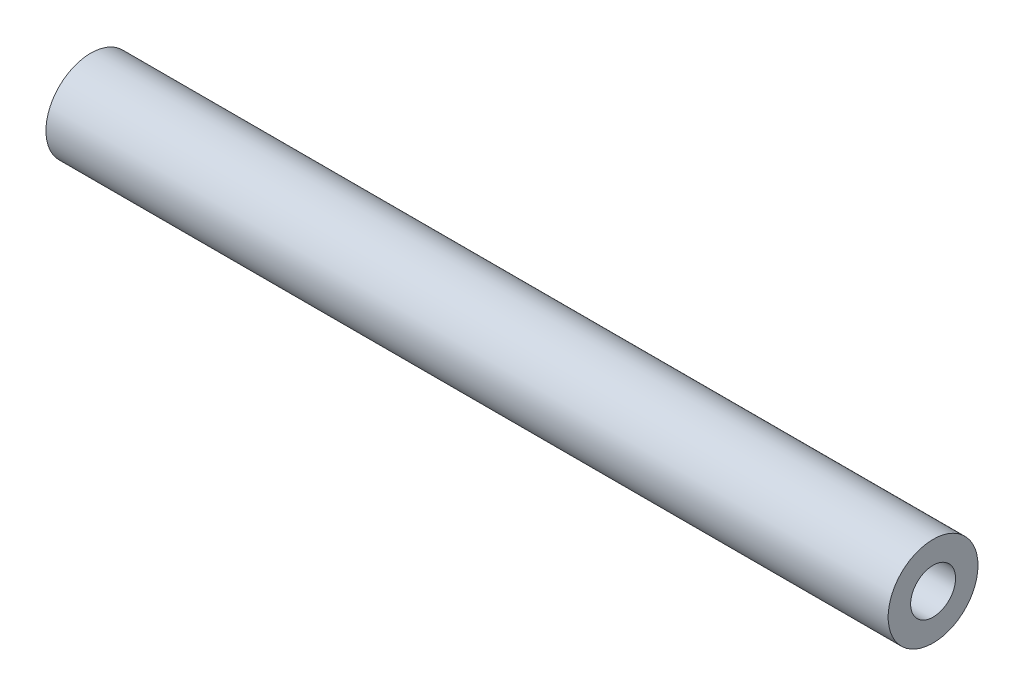
ISO-10303-21;
HEADER;
FILE_DESCRIPTION(('STEP AP214'),'2;1');
FILE_NAME('part.step','',(''),(''),'','','');
FILE_SCHEMA(('AUTOMOTIVE_DESIGN { 1 0 10303 214 1 1 1 1 }'));
ENDSEC;
DATA;
#1=APPLICATION_CONTEXT('core data for automotive mechanical design processes');
#2=APPLICATION_PROTOCOL_DEFINITION('international standard','automotive_design',2000,#1);
#3=PRODUCT_CONTEXT('',#1,'mechanical');
#4=PRODUCT('Part','Part','',(#3));
#5=PRODUCT_RELATED_PRODUCT_CATEGORY('part','',(#4));
#6=PRODUCT_DEFINITION_FORMATION('','',#4);
#7=PRODUCT_DEFINITION_CONTEXT('part definition',#1,'design');
#8=PRODUCT_DEFINITION('design','',#6,#7);
#9=PRODUCT_DEFINITION_SHAPE('','',#8);
#10=(LENGTH_UNIT() NAMED_UNIT(*) SI_UNIT(.MILLI.,.METRE.));
#11=(NAMED_UNIT(*) PLANE_ANGLE_UNIT() SI_UNIT($,.RADIAN.));
#12=(NAMED_UNIT(*) SI_UNIT($,.STERADIAN.) SOLID_ANGLE_UNIT());
#13=UNCERTAINTY_MEASURE_WITH_UNIT(LENGTH_MEASURE(1.E-05),#10,'distance_accuracy_value','');
#14=(GEOMETRIC_REPRESENTATION_CONTEXT(3) GLOBAL_UNCERTAINTY_ASSIGNED_CONTEXT((#13)) GLOBAL_UNIT_ASSIGNED_CONTEXT((#10,
#11,#12)) REPRESENTATION_CONTEXT('',''));
#15=CARTESIAN_POINT('',(0.,0.,0.));
#16=DIRECTION('',(0.,0.,1.));
#17=DIRECTION('',(1.,0.,0.));
#18=AXIS2_PLACEMENT_3D('',#15,#16,#17);
#19=CARTESIAN_POINT('',(37.5,0.,0.));
#20=DIRECTION('',(-1.,0.,0.));
#21=DIRECTION('',(0.,0.,1.));
#22=AXIS2_PLACEMENT_3D('',#19,#20,#21);
#23=CYLINDRICAL_SURFACE('',#22,4.);
#24=CARTESIAN_POINT('',(37.5,0.,0.));
#25=DIRECTION('',(1.,0.,0.));
#26=DIRECTION('',(0.,0.,-1.));
#27=AXIS2_PLACEMENT_3D('',#24,#25,#26);
#28=CIRCLE('',#27,4.);
#29=CARTESIAN_POINT('',(37.5,0.,-4.));
#30=VERTEX_POINT('',#29);
#31=EDGE_CURVE('E10',#30,#30,#28,.T.);
#32=ORIENTED_EDGE('',*,*,#31,.F.);
#33=EDGE_LOOP('',(#32));
#34=FACE_BOUND('',#33,.T.);
#35=CARTESIAN_POINT('',(-37.5,0.,0.));
#36=DIRECTION('',(1.,0.,0.));
#37=DIRECTION('',(0.,0.,-1.));
#38=AXIS2_PLACEMENT_3D('',#35,#36,#37);
#39=CIRCLE('',#38,4.);
#40=CARTESIAN_POINT('',(-37.5,0.,-4.));
#41=VERTEX_POINT('',#40);
#42=EDGE_CURVE('E46',#41,#41,#39,.T.);
#43=ORIENTED_EDGE('',*,*,#42,.T.);
#44=EDGE_LOOP('',(#43));
#45=FACE_BOUND('',#44,.T.);
#46=ADVANCED_FACE('F43',(#34,#45),#23,.T.);
#47=CARTESIAN_POINT('',(37.5,0.,0.));
#48=DIRECTION('',(1.,0.,0.));
#49=DIRECTION('',(0.,0.,-1.));
#50=AXIS2_PLACEMENT_3D('',#47,#48,#49);
#51=PLANE('',#50);
#52=CARTESIAN_POINT('',(37.5,0.,0.));
#53=DIRECTION('',(1.,0.,0.));
#54=DIRECTION('',(0.,0.,-1.));
#55=AXIS2_PLACEMENT_3D('',#52,#53,#54);
#56=CIRCLE('',#55,2.);
#57=CARTESIAN_POINT('',(37.5,0.,-2.));
#58=VERTEX_POINT('',#57);
#59=EDGE_CURVE('E59',#58,#58,#56,.T.);
#60=ORIENTED_EDGE('',*,*,#59,.F.);
#61=EDGE_LOOP('',(#60));
#62=FACE_BOUND('',#61,.T.);
#63=ORIENTED_EDGE('',*,*,#31,.T.);
#64=EDGE_LOOP('',(#63));
#65=FACE_BOUND('',#64,.T.);
#66=ADVANCED_FACE('F90',(#62,#65),#51,.T.);
#67=CARTESIAN_POINT('',(-37.5,0.,0.));
#68=DIRECTION('',(1.,0.,0.));
#69=DIRECTION('',(0.,0.,-1.));
#70=AXIS2_PLACEMENT_3D('',#67,#68,#69);
#71=PLANE('',#70);
#72=CARTESIAN_POINT('',(-37.5,0.,0.));
#73=DIRECTION('',(-1.,0.,0.));
#74=DIRECTION('',(0.,0.,1.));
#75=AXIS2_PLACEMENT_3D('',#72,#73,#74);
#76=CIRCLE('',#75,2.);
#77=CARTESIAN_POINT('',(-37.5,0.,2.));
#78=VERTEX_POINT('',#77);
#79=EDGE_CURVE('E69',#78,#78,#76,.T.);
#80=ORIENTED_EDGE('',*,*,#79,.F.);
#81=EDGE_LOOP('',(#80));
#82=FACE_BOUND('',#81,.T.);
#83=ORIENTED_EDGE('',*,*,#42,.F.);
#84=EDGE_LOOP('',(#83));
#85=FACE_BOUND('',#84,.T.);
#86=ADVANCED_FACE('F83',(#82,#85),#71,.F.);
#87=CARTESIAN_POINT('',(22.5,0.,0.));
#88=DIRECTION('',(1.,0.,0.));
#89=DIRECTION('',(0.,0.,-1.));
#90=AXIS2_PLACEMENT_3D('',#87,#88,#89);
#91=CYLINDRICAL_SURFACE('',#90,2.);
#92=CARTESIAN_POINT('',(22.5,0.,0.));
#93=DIRECTION('',(1.,0.,0.));
#94=DIRECTION('',(0.,0.,-1.));
#95=AXIS2_PLACEMENT_3D('',#92,#93,#94);
#96=CIRCLE('',#95,2.);
#97=CARTESIAN_POINT('',(22.5,0.,-2.));
#98=VERTEX_POINT('',#97);
#99=EDGE_CURVE('E57',#98,#98,#96,.T.);
#100=ORIENTED_EDGE('',*,*,#99,.F.);
#101=EDGE_LOOP('',(#100));
#102=FACE_BOUND('',#101,.T.);
#103=ORIENTED_EDGE('',*,*,#59,.T.);
#104=EDGE_LOOP('',(#103));
#105=FACE_BOUND('',#104,.T.);
#106=ADVANCED_FACE('F86',(#102,#105),#91,.F.);
#107=CARTESIAN_POINT('',(22.5,0.,0.));
#108=DIRECTION('',(1.,0.,0.));
#109=DIRECTION('',(0.,0.,-1.));
#110=AXIS2_PLACEMENT_3D('',#107,#108,#109);
#111=PLANE('',#110);
#112=ORIENTED_EDGE('',*,*,#99,.T.);
#113=EDGE_LOOP('',(#112));
#114=FACE_BOUND('',#113,.T.);
#115=ADVANCED_FACE('F78',(#114),#111,.T.);
#116=CARTESIAN_POINT('',(-22.5,0.,0.));
#117=DIRECTION('',(-1.,0.,0.));
#118=DIRECTION('',(0.,0.,1.));
#119=AXIS2_PLACEMENT_3D('',#116,#117,#118);
#120=CYLINDRICAL_SURFACE('',#119,2.);
#121=CARTESIAN_POINT('',(-22.5,0.,0.));
#122=DIRECTION('',(-1.,0.,0.));
#123=DIRECTION('',(0.,0.,1.));
#124=AXIS2_PLACEMENT_3D('',#121,#122,#123);
#125=CIRCLE('',#124,2.);
#126=CARTESIAN_POINT('',(-22.5,0.,2.));
#127=VERTEX_POINT('',#126);
#128=EDGE_CURVE('E61',#127,#127,#125,.T.);
#129=ORIENTED_EDGE('',*,*,#128,.F.);
#130=EDGE_LOOP('',(#129));
#131=FACE_BOUND('',#130,.T.);
#132=ORIENTED_EDGE('',*,*,#79,.T.);
#133=EDGE_LOOP('',(#132));
#134=FACE_BOUND('',#133,.T.);
#135=ADVANCED_FACE('F80',(#131,#134),#120,.F.);
#136=CARTESIAN_POINT('',(-22.5,0.,0.));
#137=DIRECTION('',(-1.,0.,0.));
#138=DIRECTION('',(0.,0.,1.));
#139=AXIS2_PLACEMENT_3D('',#136,#137,#138);
#140=PLANE('',#139);
#141=ORIENTED_EDGE('',*,*,#128,.T.);
#142=EDGE_LOOP('',(#141));
#143=FACE_BOUND('',#142,.T.);
#144=ADVANCED_FACE('F73',(#143),#140,.T.);
#145=CLOSED_SHELL('',(#46,#66,#86,#106,#115,#135,#144));
#146=MANIFOLD_SOLID_BREP('B2',#145);
#147=ADVANCED_BREP_SHAPE_REPRESENTATION('',(#18,#146),#14);
#148=SHAPE_DEFINITION_REPRESENTATION(#9,#147);
ENDSEC;
END-ISO-10303-21;
